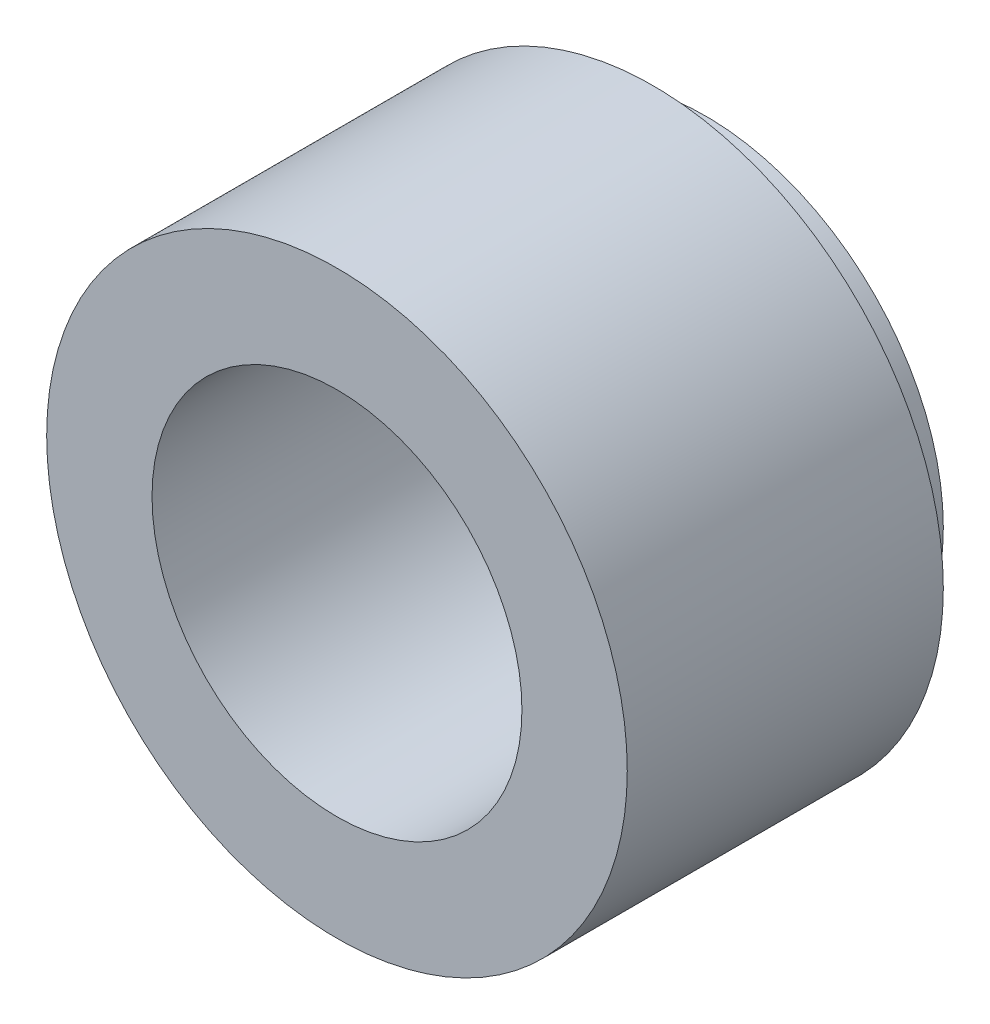
ISO-10303-21;
HEADER;
FILE_DESCRIPTION(('STEP AP214'),'2;1');
FILE_NAME('part.step','',(''),(''),'','','');
FILE_SCHEMA(('AUTOMOTIVE_DESIGN { 1 0 10303 214 1 1 1 1 }'));
ENDSEC;
DATA;
#1=APPLICATION_CONTEXT('core data for automotive mechanical design processes');
#2=APPLICATION_PROTOCOL_DEFINITION('international standard','automotive_design',2000,#1);
#3=PRODUCT_CONTEXT('',#1,'mechanical');
#4=PRODUCT('Part','Part','',(#3));
#5=PRODUCT_RELATED_PRODUCT_CATEGORY('part','',(#4));
#6=PRODUCT_DEFINITION_FORMATION('','',#4);
#7=PRODUCT_DEFINITION_CONTEXT('part definition',#1,'design');
#8=PRODUCT_DEFINITION('design','',#6,#7);
#9=PRODUCT_DEFINITION_SHAPE('','',#8);
#10=(LENGTH_UNIT() NAMED_UNIT(*) SI_UNIT(.MILLI.,.METRE.));
#11=(NAMED_UNIT(*) PLANE_ANGLE_UNIT() SI_UNIT($,.RADIAN.));
#12=(NAMED_UNIT(*) SI_UNIT($,.STERADIAN.) SOLID_ANGLE_UNIT());
#13=UNCERTAINTY_MEASURE_WITH_UNIT(LENGTH_MEASURE(1.E-05),#10,'distance_accuracy_value','');
#14=(GEOMETRIC_REPRESENTATION_CONTEXT(3) GLOBAL_UNCERTAINTY_ASSIGNED_CONTEXT((#13)) GLOBAL_UNIT_ASSIGNED_CONTEXT((#10,
#11,#12)) REPRESENTATION_CONTEXT('',''));
#15=CARTESIAN_POINT('',(0.,0.,0.));
#16=DIRECTION('',(0.,0.,1.));
#17=DIRECTION('',(1.,0.,0.));
#18=AXIS2_PLACEMENT_3D('',#15,#16,#17);
#19=CARTESIAN_POINT('',(0.,-2.58303199590893,33.7232266803036));
#20=DIRECTION('',(0.,0.,1.));
#21=DIRECTION('',(1.,0.,0.));
#22=AXIS2_PLACEMENT_3D('',#19,#20,#21);
#23=CYLINDRICAL_SURFACE('',#22,12.7);
#24=CARTESIAN_POINT('',(0.,-2.58303199590893,-12.1732623138657));
#25=DIRECTION('',(0.,0.,1.));
#26=DIRECTION('',(1.,0.,0.));
#27=AXIS2_PLACEMENT_3D('',#24,#25,#26);
#28=CIRCLE('',#27,12.7);
#29=CARTESIAN_POINT('',(12.7,-2.58303199590893,-12.1732623138657));
#30=VERTEX_POINT('',#29);
#31=EDGE_CURVE('E51',#30,#30,#28,.T.);
#32=ORIENTED_EDGE('',*,*,#31,.F.);
#33=EDGE_LOOP('',(#32));
#34=FACE_BOUND('',#33,.T.);
#35=CARTESIAN_POINT('',(0.,-2.58303199590893,13.1454576861343));
#36=DIRECTION('',(0.,0.,1.));
#37=DIRECTION('',(1.,0.,0.));
#38=AXIS2_PLACEMENT_3D('',#35,#36,#37);
#39=CIRCLE('',#38,12.7);
#40=CARTESIAN_POINT('',(12.7,-2.58303199590893,13.1454576861343));
#41=VERTEX_POINT('',#40);
#42=EDGE_CURVE('E10',#41,#41,#39,.T.);
#43=ORIENTED_EDGE('',*,*,#42,.T.);
#44=EDGE_LOOP('',(#43));
#45=FACE_BOUND('',#44,.T.);
#46=ADVANCED_FACE('F29',(#34,#45),#23,.F.);
#47=CARTESIAN_POINT('',(0.,10.1169680040911,13.1454576861343));
#48=DIRECTION('',(0.,0.,-1.));
#49=DIRECTION('',(-1.,0.,0.));
#50=AXIS2_PLACEMENT_3D('',#47,#48,#49);
#51=PLANE('',#50);
#52=ORIENTED_EDGE('',*,*,#42,.F.);
#53=EDGE_LOOP('',(#52));
#54=FACE_BOUND('',#53,.T.);
#55=CARTESIAN_POINT('',(0.,-2.58303199590893,13.1454576861343));
#56=DIRECTION('',(0.,0.,1.));
#57=DIRECTION('',(1.,0.,0.));
#58=AXIS2_PLACEMENT_3D('',#55,#56,#57);
#59=CIRCLE('',#58,19.93392);
#60=CARTESIAN_POINT('',(19.93392,-2.58303199590893,13.1454576861343));
#61=VERTEX_POINT('',#60);
#62=EDGE_CURVE('E35',#61,#61,#59,.T.);
#63=ORIENTED_EDGE('',*,*,#62,.T.);
#64=EDGE_LOOP('',(#63));
#65=FACE_BOUND('',#64,.T.);
#66=ADVANCED_FACE('F58',(#54,#65),#51,.F.);
#67=CARTESIAN_POINT('',(0.,-2.58303199590893,33.7232266803036));
#68=DIRECTION('',(0.,0.,1.));
#69=DIRECTION('',(1.,0.,0.));
#70=AXIS2_PLACEMENT_3D('',#67,#68,#69);
#71=CYLINDRICAL_SURFACE('',#70,19.93392);
#72=ORIENTED_EDGE('',*,*,#62,.F.);
#73=EDGE_LOOP('',(#72));
#74=FACE_BOUND('',#73,.T.);
#75=CARTESIAN_POINT('',(0.,-2.58303199590893,-8.55630231386567));
#76=DIRECTION('',(0.,0.,1.));
#77=DIRECTION('',(1.,0.,0.));
#78=AXIS2_PLACEMENT_3D('',#75,#76,#77);
#79=CIRCLE('',#78,19.93392);
#80=CARTESIAN_POINT('',(19.93392,-2.58303199590893,-8.55630231386567));
#81=VERTEX_POINT('',#80);
#82=EDGE_CURVE('E39',#81,#81,#79,.T.);
#83=ORIENTED_EDGE('',*,*,#82,.T.);
#84=EDGE_LOOP('',(#83));
#85=FACE_BOUND('',#84,.T.);
#86=ADVANCED_FACE('F62',(#74,#85),#71,.T.);
#87=CARTESIAN_POINT('',(0.,17.3508880040911,-8.55630231386567));
#88=DIRECTION('',(0.,0.,1.));
#89=DIRECTION('',(1.,0.,0.));
#90=AXIS2_PLACEMENT_3D('',#87,#88,#89);
#91=PLANE('',#90);
#92=ORIENTED_EDGE('',*,*,#82,.F.);
#93=EDGE_LOOP('',(#92));
#94=FACE_BOUND('',#93,.T.);
#95=CARTESIAN_POINT('',(0.,-2.58303199590893,-8.55630231386567));
#96=DIRECTION('',(0.,0.,1.));
#97=DIRECTION('',(1.,0.,0.));
#98=AXIS2_PLACEMENT_3D('',#95,#96,#97);
#99=CIRCLE('',#98,16.31696);
#100=CARTESIAN_POINT('',(16.31696,-2.58303199590893,-8.55630231386567));
#101=VERTEX_POINT('',#100);
#102=EDGE_CURVE('E43',#101,#101,#99,.T.);
#103=ORIENTED_EDGE('',*,*,#102,.T.);
#104=EDGE_LOOP('',(#103));
#105=FACE_BOUND('',#104,.T.);
#106=ADVANCED_FACE('F67',(#94,#105),#91,.F.);
#107=CARTESIAN_POINT('',(0.,-2.58303199590893,33.7232266803036));
#108=DIRECTION('',(0.,0.,1.));
#109=DIRECTION('',(1.,0.,0.));
#110=AXIS2_PLACEMENT_3D('',#107,#108,#109);
#111=CYLINDRICAL_SURFACE('',#110,16.31696);
#112=ORIENTED_EDGE('',*,*,#102,.F.);
#113=EDGE_LOOP('',(#112));
#114=FACE_BOUND('',#113,.T.);
#115=CARTESIAN_POINT('',(0.,-2.58303199590893,-12.1732623138657));
#116=DIRECTION('',(0.,0.,1.));
#117=DIRECTION('',(1.,0.,0.));
#118=AXIS2_PLACEMENT_3D('',#115,#116,#117);
#119=CIRCLE('',#118,16.31696);
#120=CARTESIAN_POINT('',(16.31696,-2.58303199590893,-12.1732623138657));
#121=VERTEX_POINT('',#120);
#122=EDGE_CURVE('E48',#121,#121,#119,.T.);
#123=ORIENTED_EDGE('',*,*,#122,.T.);
#124=EDGE_LOOP('',(#123));
#125=FACE_BOUND('',#124,.T.);
#126=ADVANCED_FACE('F73',(#114,#125),#111,.T.);
#127=CARTESIAN_POINT('',(0.,13.7339280040911,-12.1732623138657));
#128=DIRECTION('',(0.,0.,1.));
#129=DIRECTION('',(1.,0.,0.));
#130=AXIS2_PLACEMENT_3D('',#127,#128,#129);
#131=PLANE('',#130);
#132=ORIENTED_EDGE('',*,*,#122,.F.);
#133=EDGE_LOOP('',(#132));
#134=FACE_BOUND('',#133,.T.);
#135=ORIENTED_EDGE('',*,*,#31,.T.);
#136=EDGE_LOOP('',(#135));
#137=FACE_BOUND('',#136,.T.);
#138=ADVANCED_FACE('F55',(#134,#137),#131,.F.);
#139=CLOSED_SHELL('',(#46,#66,#86,#106,#126,#138));
#140=MANIFOLD_SOLID_BREP('B2',#139);
#141=ADVANCED_BREP_SHAPE_REPRESENTATION('',(#18,#140),#14);
#142=SHAPE_DEFINITION_REPRESENTATION(#9,#141);
ENDSEC;
END-ISO-10303-21;
